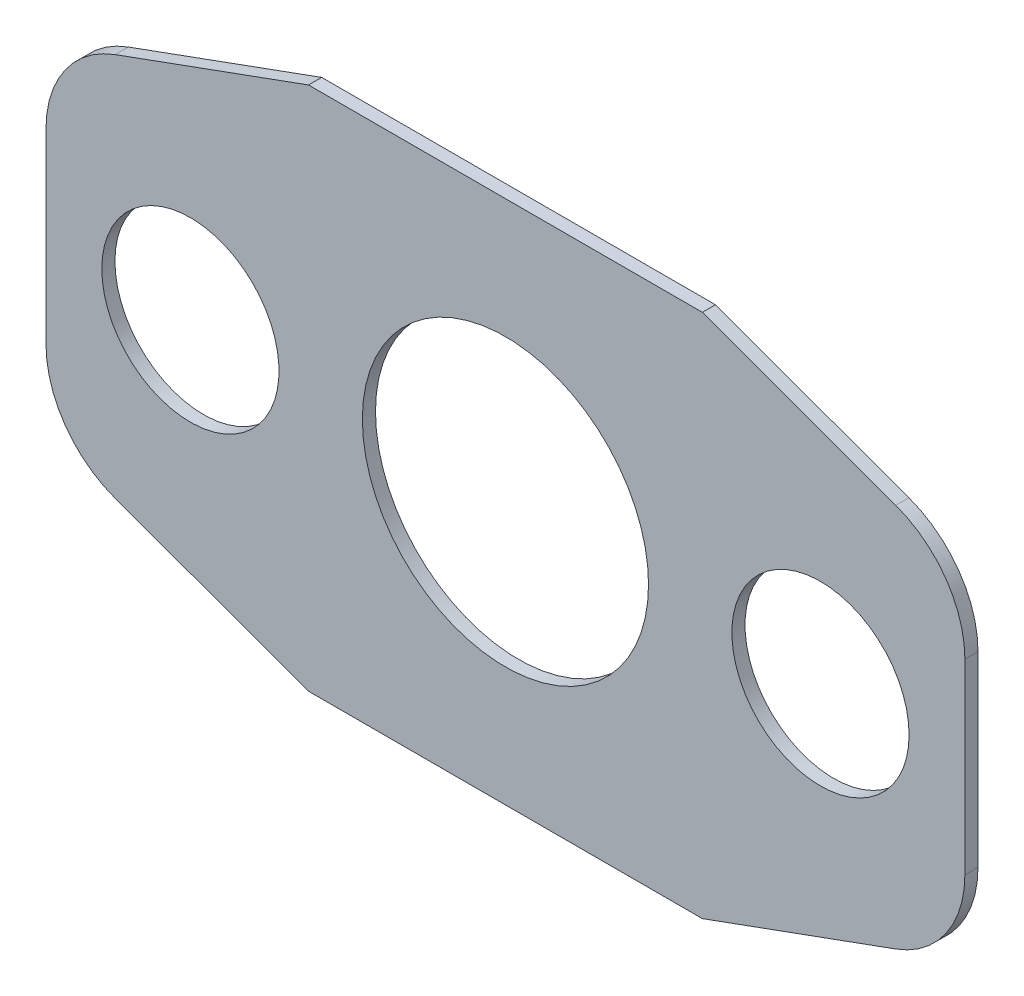
ISO-10303-21;
HEADER;
FILE_DESCRIPTION(('STEP AP214'),'2;1');
FILE_NAME('part.step','',(''),(''),'','','');
FILE_SCHEMA(('AUTOMOTIVE_DESIGN { 1 0 10303 214 1 1 1 1 }'));
ENDSEC;
DATA;
#1=APPLICATION_CONTEXT('core data for automotive mechanical design processes');
#2=APPLICATION_PROTOCOL_DEFINITION('international standard','automotive_design',2000,#1);
#3=PRODUCT_CONTEXT('',#1,'mechanical');
#4=PRODUCT('Part','Part','',(#3));
#5=PRODUCT_RELATED_PRODUCT_CATEGORY('part','',(#4));
#6=PRODUCT_DEFINITION_FORMATION('','',#4);
#7=PRODUCT_DEFINITION_CONTEXT('part definition',#1,'design');
#8=PRODUCT_DEFINITION('design','',#6,#7);
#9=PRODUCT_DEFINITION_SHAPE('','',#8);
#10=(LENGTH_UNIT() NAMED_UNIT(*) SI_UNIT(.MILLI.,.METRE.));
#11=(NAMED_UNIT(*) PLANE_ANGLE_UNIT() SI_UNIT($,.RADIAN.));
#12=(NAMED_UNIT(*) SI_UNIT($,.STERADIAN.) SOLID_ANGLE_UNIT());
#13=UNCERTAINTY_MEASURE_WITH_UNIT(LENGTH_MEASURE(1.E-05),#10,'distance_accuracy_value','');
#14=(GEOMETRIC_REPRESENTATION_CONTEXT(3) GLOBAL_UNCERTAINTY_ASSIGNED_CONTEXT((#13)) GLOBAL_UNIT_ASSIGNED_CONTEXT((#10,
#11,#12)) REPRESENTATION_CONTEXT('',''));
#15=CARTESIAN_POINT('',(0.,0.,0.));
#16=DIRECTION('',(0.,0.,1.));
#17=DIRECTION('',(1.,0.,0.));
#18=AXIS2_PLACEMENT_3D('',#15,#16,#17);
#19=CARTESIAN_POINT('',(27.,7.11893500899826,-1.));
#20=DIRECTION('',(0.,0.,1.));
#21=DIRECTION('',(1.,0.,0.));
#22=AXIS2_PLACEMENT_3D('',#19,#20,#21);
#23=CYLINDRICAL_SURFACE('',#22,8.);
#24=CARTESIAN_POINT('',(27.,7.11893500899826,0.));
#25=DIRECTION('',(0.,0.,1.));
#26=DIRECTION('',(-1.,0.,0.));
#27=AXIS2_PLACEMENT_3D('',#24,#25,#26);
#28=CIRCLE('',#27,8.);
#29=CARTESIAN_POINT('',(35.,7.11893500899827,0.));
#30=VERTEX_POINT('',#29);
#31=CARTESIAN_POINT('',(29.7361611466054,14.6364759752855,0.));
#32=VERTEX_POINT('',#31);
#33=EDGE_CURVE('E162',#30,#32,#28,.T.);
#34=ORIENTED_EDGE('',*,*,#33,.F.);
#35=DIRECTION('',(0.,0.,1.));
#36=VECTOR('',#35,1.);
#37=CARTESIAN_POINT('',(35.,7.11893500899827,-1.));
#38=LINE('',#37,#36);
#39=CARTESIAN_POINT('',(35.,7.11893500899827,-1.));
#40=VERTEX_POINT('',#39);
#41=EDGE_CURVE('E11',#40,#30,#38,.T.);
#42=ORIENTED_EDGE('',*,*,#41,.F.);
#43=CARTESIAN_POINT('',(27.,7.11893500899826,-1.));
#44=DIRECTION('',(0.,0.,1.));
#45=DIRECTION('',(-1.,0.,0.));
#46=AXIS2_PLACEMENT_3D('',#43,#44,#45);
#47=CIRCLE('',#46,8.);
#48=CARTESIAN_POINT('',(29.7361611466054,14.6364759752855,-1.));
#49=VERTEX_POINT('',#48);
#50=EDGE_CURVE('E195',#40,#49,#47,.T.);
#51=ORIENTED_EDGE('',*,*,#50,.T.);
#52=DIRECTION('',(0.,0.,1.));
#53=VECTOR('',#52,1.);
#54=CARTESIAN_POINT('',(29.7361611466054,14.6364759752855,-1.));
#55=LINE('',#54,#53);
#56=EDGE_CURVE('E44',#49,#32,#55,.T.);
#57=ORIENTED_EDGE('',*,*,#56,.T.);
#58=EDGE_LOOP('',(#34,#42,#51,#57));
#59=FACE_BOUND('',#58,.T.);
#60=ADVANCED_FACE('F41',(#59),#23,.T.);
#61=CARTESIAN_POINT('',(35.,7.11893500899827,-1.));
#62=DIRECTION('',(1.,0.,0.));
#63=DIRECTION('',(0.,0.,-1.));
#64=AXIS2_PLACEMENT_3D('',#61,#62,#63);
#65=PLANE('',#64);
#66=DIRECTION('',(0.,1.,0.));
#67=VECTOR('',#66,1.);
#68=CARTESIAN_POINT('',(35.,7.11893500899827,0.));
#69=LINE('',#68,#67);
#70=CARTESIAN_POINT('',(35.,-7.11893500899827,0.));
#71=VERTEX_POINT('',#70);
#72=EDGE_CURVE('E193',#71,#30,#69,.T.);
#73=ORIENTED_EDGE('',*,*,#72,.F.);
#74=DIRECTION('',(0.,0.,1.));
#75=VECTOR('',#74,1.);
#76=CARTESIAN_POINT('',(35.,-7.11893500899827,-1.));
#77=LINE('',#76,#75);
#78=CARTESIAN_POINT('',(35.,-7.11893500899827,-1.));
#79=VERTEX_POINT('',#78);
#80=EDGE_CURVE('E50',#79,#71,#77,.T.);
#81=ORIENTED_EDGE('',*,*,#80,.F.);
#82=DIRECTION('',(0.,1.,0.));
#83=VECTOR('',#82,1.);
#84=CARTESIAN_POINT('',(35.,7.11893500899827,-1.));
#85=LINE('',#84,#83);
#86=EDGE_CURVE('E152',#79,#40,#85,.T.);
#87=ORIENTED_EDGE('',*,*,#86,.T.);
#88=ORIENTED_EDGE('',*,*,#41,.T.);
#89=EDGE_LOOP('',(#73,#81,#87,#88));
#90=FACE_BOUND('',#89,.T.);
#91=ADVANCED_FACE('F215',(#90),#65,.T.);
#92=CARTESIAN_POINT('',(27.,-7.11893500899827,-1.));
#93=DIRECTION('',(0.,0.,1.));
#94=DIRECTION('',(1.,0.,0.));
#95=AXIS2_PLACEMENT_3D('',#92,#93,#94);
#96=CYLINDRICAL_SURFACE('',#95,8.);
#97=CARTESIAN_POINT('',(27.,-7.11893500899827,0.));
#98=DIRECTION('',(0.,0.,1.));
#99=DIRECTION('',(1.,0.,0.));
#100=AXIS2_PLACEMENT_3D('',#97,#98,#99);
#101=CIRCLE('',#100,8.);
#102=CARTESIAN_POINT('',(29.7361611466054,-14.6364759752855,0.));
#103=VERTEX_POINT('',#102);
#104=EDGE_CURVE('E139',#103,#71,#101,.T.);
#105=ORIENTED_EDGE('',*,*,#104,.F.);
#106=DIRECTION('',(0.,0.,1.));
#107=VECTOR('',#106,1.);
#108=CARTESIAN_POINT('',(29.7361611466054,-14.6364759752855,-1.));
#109=LINE('',#108,#107);
#110=CARTESIAN_POINT('',(29.7361611466054,-14.6364759752855,-1.));
#111=VERTEX_POINT('',#110);
#112=EDGE_CURVE('E134',#111,#103,#109,.T.);
#113=ORIENTED_EDGE('',*,*,#112,.F.);
#114=CARTESIAN_POINT('',(27.,-7.11893500899827,-1.));
#115=DIRECTION('',(0.,0.,1.));
#116=DIRECTION('',(1.,0.,0.));
#117=AXIS2_PLACEMENT_3D('',#114,#115,#116);
#118=CIRCLE('',#117,8.);
#119=EDGE_CURVE('E137',#111,#79,#118,.T.);
#120=ORIENTED_EDGE('',*,*,#119,.T.);
#121=ORIENTED_EDGE('',*,*,#80,.T.);
#122=EDGE_LOOP('',(#105,#113,#120,#121));
#123=FACE_BOUND('',#122,.T.);
#124=ADVANCED_FACE('F136',(#123),#96,.T.);
#125=CARTESIAN_POINT('',(15.,-20.,-1.));
#126=DIRECTION('',(0.34202014332567,-0.939692620785908,0.));
#127=DIRECTION('',(0.939692620785908,0.34202014332567,0.));
#128=AXIS2_PLACEMENT_3D('',#125,#126,#127);
#129=PLANE('',#128);
#130=DIRECTION('',(0.939692620785908,0.34202014332567,0.));
#131=VECTOR('',#130,1.);
#132=CARTESIAN_POINT('',(15.,-20.,0.));
#133=LINE('',#132,#131);
#134=CARTESIAN_POINT('',(15.,-20.,0.));
#135=VERTEX_POINT('',#134);
#136=EDGE_CURVE('E190',#135,#103,#133,.T.);
#137=ORIENTED_EDGE('',*,*,#136,.F.);
#138=DIRECTION('',(0.,0.,1.));
#139=VECTOR('',#138,1.);
#140=CARTESIAN_POINT('',(15.,-20.,-1.));
#141=LINE('',#140,#139);
#142=CARTESIAN_POINT('',(15.,-20.,-1.));
#143=VERTEX_POINT('',#142);
#144=EDGE_CURVE('E144',#143,#135,#141,.T.);
#145=ORIENTED_EDGE('',*,*,#144,.F.);
#146=DIRECTION('',(0.939692620785908,0.34202014332567,0.));
#147=VECTOR('',#146,1.);
#148=CARTESIAN_POINT('',(15.,-20.,-1.));
#149=LINE('',#148,#147);
#150=EDGE_CURVE('E150',#143,#111,#149,.T.);
#151=ORIENTED_EDGE('',*,*,#150,.T.);
#152=ORIENTED_EDGE('',*,*,#112,.T.);
#153=EDGE_LOOP('',(#137,#145,#151,#152));
#154=FACE_BOUND('',#153,.T.);
#155=ADVANCED_FACE('F154',(#154),#129,.T.);
#156=CARTESIAN_POINT('',(-15.,-20.,-1.));
#157=DIRECTION('',(0.,-1.,0.));
#158=DIRECTION('',(0.,0.,-1.));
#159=AXIS2_PLACEMENT_3D('',#156,#157,#158);
#160=PLANE('',#159);
#161=DIRECTION('',(1.,0.,0.));
#162=VECTOR('',#161,1.);
#163=CARTESIAN_POINT('',(-15.,-20.,0.));
#164=LINE('',#163,#162);
#165=CARTESIAN_POINT('',(-15.,-20.,0.));
#166=VERTEX_POINT('',#165);
#167=EDGE_CURVE('E187',#166,#135,#164,.T.);
#168=ORIENTED_EDGE('',*,*,#167,.F.);
#169=DIRECTION('',(0.,0.,1.));
#170=VECTOR('',#169,1.);
#171=CARTESIAN_POINT('',(-15.,-20.,-1.));
#172=LINE('',#171,#170);
#173=CARTESIAN_POINT('',(-15.,-20.,-1.));
#174=VERTEX_POINT('',#173);
#175=EDGE_CURVE('E199',#174,#166,#172,.T.);
#176=ORIENTED_EDGE('',*,*,#175,.F.);
#177=DIRECTION('',(1.,0.,0.));
#178=VECTOR('',#177,1.);
#179=CARTESIAN_POINT('',(-15.,-20.,-1.));
#180=LINE('',#179,#178);
#181=EDGE_CURVE('E155',#174,#143,#180,.T.);
#182=ORIENTED_EDGE('',*,*,#181,.T.);
#183=ORIENTED_EDGE('',*,*,#144,.T.);
#184=EDGE_LOOP('',(#168,#176,#182,#183));
#185=FACE_BOUND('',#184,.T.);
#186=ADVANCED_FACE('F228',(#185),#160,.T.);
#187=CARTESIAN_POINT('',(-15.,-20.,-1.));
#188=DIRECTION('',(-0.342020143325669,-0.939692620785908,0.));
#189=DIRECTION('',(0.939692620785908,-0.342020143325669,0.));
#190=AXIS2_PLACEMENT_3D('',#187,#188,#189);
#191=PLANE('',#190);
#192=DIRECTION('',(0.939692620785908,-0.342020143325669,0.));
#193=VECTOR('',#192,1.);
#194=CARTESIAN_POINT('',(-15.,-20.,0.));
#195=LINE('',#194,#193);
#196=CARTESIAN_POINT('',(-29.7361611466054,-14.6364759752855,0.));
#197=VERTEX_POINT('',#196);
#198=EDGE_CURVE('E184',#197,#166,#195,.T.);
#199=ORIENTED_EDGE('',*,*,#198,.F.);
#200=DIRECTION('',(0.,0.,1.));
#201=VECTOR('',#200,1.);
#202=CARTESIAN_POINT('',(-29.7361611466054,-14.6364759752855,-1.));
#203=LINE('',#202,#201);
#204=CARTESIAN_POINT('',(-29.7361611466054,-14.6364759752855,-1.));
#205=VERTEX_POINT('',#204);
#206=EDGE_CURVE('E201',#205,#197,#203,.T.);
#207=ORIENTED_EDGE('',*,*,#206,.F.);
#208=DIRECTION('',(0.939692620785908,-0.342020143325669,0.));
#209=VECTOR('',#208,1.);
#210=CARTESIAN_POINT('',(-15.,-20.,-1.));
#211=LINE('',#210,#209);
#212=EDGE_CURVE('E157',#205,#174,#211,.T.);
#213=ORIENTED_EDGE('',*,*,#212,.T.);
#214=ORIENTED_EDGE('',*,*,#175,.T.);
#215=EDGE_LOOP('',(#199,#207,#213,#214));
#216=FACE_BOUND('',#215,.T.);
#217=ADVANCED_FACE('F231',(#216),#191,.T.);
#218=CARTESIAN_POINT('',(-27.,-7.11893500899828,-1.));
#219=DIRECTION('',(0.,0.,1.));
#220=DIRECTION('',(1.,0.,0.));
#221=AXIS2_PLACEMENT_3D('',#218,#219,#220);
#222=CYLINDRICAL_SURFACE('',#221,8.);
#223=CARTESIAN_POINT('',(-27.,-7.11893500899828,0.));
#224=DIRECTION('',(0.,0.,1.));
#225=DIRECTION('',(-1.,0.,0.));
#226=AXIS2_PLACEMENT_3D('',#223,#224,#225);
#227=CIRCLE('',#226,8.);
#228=CARTESIAN_POINT('',(-35.,-7.11893500899828,0.));
#229=VERTEX_POINT('',#228);
#230=EDGE_CURVE('E181',#229,#197,#227,.T.);
#231=ORIENTED_EDGE('',*,*,#230,.F.);
#232=DIRECTION('',(0.,0.,1.));
#233=VECTOR('',#232,1.);
#234=CARTESIAN_POINT('',(-35.,-7.11893500899828,-1.));
#235=LINE('',#234,#233);
#236=CARTESIAN_POINT('',(-35.,-7.11893500899828,-1.));
#237=VERTEX_POINT('',#236);
#238=EDGE_CURVE('E203',#237,#229,#235,.T.);
#239=ORIENTED_EDGE('',*,*,#238,.F.);
#240=CARTESIAN_POINT('',(-27.,-7.11893500899828,-1.));
#241=DIRECTION('',(0.,0.,1.));
#242=DIRECTION('',(-1.,0.,0.));
#243=AXIS2_PLACEMENT_3D('',#240,#241,#242);
#244=CIRCLE('',#243,8.);
#245=EDGE_CURVE('E315',#237,#205,#244,.T.);
#246=ORIENTED_EDGE('',*,*,#245,.T.);
#247=ORIENTED_EDGE('',*,*,#206,.T.);
#248=EDGE_LOOP('',(#231,#239,#246,#247));
#249=FACE_BOUND('',#248,.T.);
#250=ADVANCED_FACE('F235',(#249),#222,.T.);
#251=CARTESIAN_POINT('',(-35.,7.11893500899827,-1.));
#252=DIRECTION('',(-1.,0.,0.));
#253=DIRECTION('',(0.,0.,1.));
#254=AXIS2_PLACEMENT_3D('',#251,#252,#253);
#255=PLANE('',#254);
#256=DIRECTION('',(0.,-1.,0.));
#257=VECTOR('',#256,1.);
#258=CARTESIAN_POINT('',(-35.,7.11893500899827,0.));
#259=LINE('',#258,#257);
#260=CARTESIAN_POINT('',(-35.,7.11893500899827,0.));
#261=VERTEX_POINT('',#260);
#262=EDGE_CURVE('E178',#261,#229,#259,.T.);
#263=ORIENTED_EDGE('',*,*,#262,.F.);
#264=DIRECTION('',(0.,0.,1.));
#265=VECTOR('',#264,1.);
#266=CARTESIAN_POINT('',(-35.,7.11893500899827,-1.));
#267=LINE('',#266,#265);
#268=CARTESIAN_POINT('',(-35.,7.11893500899827,-1.));
#269=VERTEX_POINT('',#268);
#270=EDGE_CURVE('E205',#269,#261,#267,.T.);
#271=ORIENTED_EDGE('',*,*,#270,.F.);
#272=DIRECTION('',(0.,-1.,0.));
#273=VECTOR('',#272,1.);
#274=CARTESIAN_POINT('',(-35.,7.11893500899827,-1.));
#275=LINE('',#274,#273);
#276=EDGE_CURVE('E312',#269,#237,#275,.T.);
#277=ORIENTED_EDGE('',*,*,#276,.T.);
#278=ORIENTED_EDGE('',*,*,#238,.T.);
#279=EDGE_LOOP('',(#263,#271,#277,#278));
#280=FACE_BOUND('',#279,.T.);
#281=ADVANCED_FACE('F239',(#280),#255,.T.);
#282=CARTESIAN_POINT('',(-27.,7.11893500899826,-1.));
#283=DIRECTION('',(0.,0.,1.));
#284=DIRECTION('',(1.,0.,0.));
#285=AXIS2_PLACEMENT_3D('',#282,#283,#284);
#286=CYLINDRICAL_SURFACE('',#285,8.);
#287=CARTESIAN_POINT('',(-27.,7.11893500899826,0.));
#288=DIRECTION('',(0.,0.,1.));
#289=DIRECTION('',(1.,0.,0.));
#290=AXIS2_PLACEMENT_3D('',#287,#288,#289);
#291=CIRCLE('',#290,8.);
#292=CARTESIAN_POINT('',(-29.7361611466054,14.6364759752855,0.));
#293=VERTEX_POINT('',#292);
#294=EDGE_CURVE('E175',#293,#261,#291,.T.);
#295=ORIENTED_EDGE('',*,*,#294,.F.);
#296=DIRECTION('',(0.,0.,1.));
#297=VECTOR('',#296,1.);
#298=CARTESIAN_POINT('',(-29.7361611466054,14.6364759752855,-1.));
#299=LINE('',#298,#297);
#300=CARTESIAN_POINT('',(-29.7361611466054,14.6364759752855,-1.));
#301=VERTEX_POINT('',#300);
#302=EDGE_CURVE('E207',#301,#293,#299,.T.);
#303=ORIENTED_EDGE('',*,*,#302,.F.);
#304=CARTESIAN_POINT('',(-27.,7.11893500899826,-1.));
#305=DIRECTION('',(0.,0.,1.));
#306=DIRECTION('',(1.,0.,0.));
#307=AXIS2_PLACEMENT_3D('',#304,#305,#306);
#308=CIRCLE('',#307,8.);
#309=EDGE_CURVE('E309',#301,#269,#308,.T.);
#310=ORIENTED_EDGE('',*,*,#309,.T.);
#311=ORIENTED_EDGE('',*,*,#270,.T.);
#312=EDGE_LOOP('',(#295,#303,#310,#311));
#313=FACE_BOUND('',#312,.T.);
#314=ADVANCED_FACE('F243',(#313),#286,.T.);
#315=CARTESIAN_POINT('',(-15.,20.,-1.));
#316=DIRECTION('',(-0.342020143325669,0.939692620785908,0.));
#317=DIRECTION('',(-0.939692620785908,-0.342020143325669,0.));
#318=AXIS2_PLACEMENT_3D('',#315,#316,#317);
#319=PLANE('',#318);
#320=DIRECTION('',(-0.939692620785908,-0.342020143325669,0.));
#321=VECTOR('',#320,1.);
#322=CARTESIAN_POINT('',(-15.,20.,0.));
#323=LINE('',#322,#321);
#324=CARTESIAN_POINT('',(-15.,20.,0.));
#325=VERTEX_POINT('',#324);
#326=EDGE_CURVE('E172',#325,#293,#323,.T.);
#327=ORIENTED_EDGE('',*,*,#326,.F.);
#328=DIRECTION('',(0.,0.,1.));
#329=VECTOR('',#328,1.);
#330=CARTESIAN_POINT('',(-15.,20.,-1.));
#331=LINE('',#330,#329);
#332=CARTESIAN_POINT('',(-15.,20.,-1.));
#333=VERTEX_POINT('',#332);
#334=EDGE_CURVE('E209',#333,#325,#331,.T.);
#335=ORIENTED_EDGE('',*,*,#334,.F.);
#336=DIRECTION('',(-0.939692620785908,-0.342020143325669,0.));
#337=VECTOR('',#336,1.);
#338=CARTESIAN_POINT('',(-15.,20.,-1.));
#339=LINE('',#338,#337);
#340=EDGE_CURVE('E306',#333,#301,#339,.T.);
#341=ORIENTED_EDGE('',*,*,#340,.T.);
#342=ORIENTED_EDGE('',*,*,#302,.T.);
#343=EDGE_LOOP('',(#327,#335,#341,#342));
#344=FACE_BOUND('',#343,.T.);
#345=ADVANCED_FACE('F247',(#344),#319,.T.);
#346=CARTESIAN_POINT('',(-15.,20.,-1.));
#347=DIRECTION('',(0.,1.,0.));
#348=DIRECTION('',(-1.,0.,0.));
#349=AXIS2_PLACEMENT_3D('',#346,#347,#348);
#350=PLANE('',#349);
#351=DIRECTION('',(-1.,0.,0.));
#352=VECTOR('',#351,1.);
#353=CARTESIAN_POINT('',(-15.,20.,0.));
#354=LINE('',#353,#352);
#355=CARTESIAN_POINT('',(15.,20.,0.));
#356=VERTEX_POINT('',#355);
#357=EDGE_CURVE('E169',#356,#325,#354,.T.);
#358=ORIENTED_EDGE('',*,*,#357,.F.);
#359=DIRECTION('',(0.,0.,1.));
#360=VECTOR('',#359,1.);
#361=CARTESIAN_POINT('',(15.,20.,-1.));
#362=LINE('',#361,#360);
#363=CARTESIAN_POINT('',(15.,20.,-1.));
#364=VERTEX_POINT('',#363);
#365=EDGE_CURVE('E210',#364,#356,#362,.T.);
#366=ORIENTED_EDGE('',*,*,#365,.F.);
#367=DIRECTION('',(-1.,0.,0.));
#368=VECTOR('',#367,1.);
#369=CARTESIAN_POINT('',(-15.,20.,-1.));
#370=LINE('',#369,#368);
#371=EDGE_CURVE('E303',#364,#333,#370,.T.);
#372=ORIENTED_EDGE('',*,*,#371,.T.);
#373=ORIENTED_EDGE('',*,*,#334,.T.);
#374=EDGE_LOOP('',(#358,#366,#372,#373));
#375=FACE_BOUND('',#374,.T.);
#376=ADVANCED_FACE('F251',(#375),#350,.T.);
#377=CARTESIAN_POINT('',(15.,20.,-1.));
#378=DIRECTION('',(0.34202014332567,0.939692620785908,0.));
#379=DIRECTION('',(-0.939692620785908,0.34202014332567,0.));
#380=AXIS2_PLACEMENT_3D('',#377,#378,#379);
#381=PLANE('',#380);
#382=DIRECTION('',(-0.939692620785908,0.342020143325669,0.));
#383=VECTOR('',#382,1.);
#384=CARTESIAN_POINT('',(15.,20.,0.));
#385=LINE('',#384,#383);
#386=EDGE_CURVE('E165',#32,#356,#385,.T.);
#387=ORIENTED_EDGE('',*,*,#386,.F.);
#388=ORIENTED_EDGE('',*,*,#56,.F.);
#389=DIRECTION('',(-0.939692620785908,0.342020143325669,0.));
#390=VECTOR('',#389,1.);
#391=CARTESIAN_POINT('',(15.,20.,-1.));
#392=LINE('',#391,#390);
#393=EDGE_CURVE('E301',#49,#364,#392,.T.);
#394=ORIENTED_EDGE('',*,*,#393,.T.);
#395=ORIENTED_EDGE('',*,*,#365,.T.);
#396=EDGE_LOOP('',(#387,#388,#394,#395));
#397=FACE_BOUND('',#396,.T.);
#398=ADVANCED_FACE('F212',(#397),#381,.T.);
#399=CARTESIAN_POINT('',(27.,7.11893500899826,-1.));
#400=DIRECTION('',(0.,0.,-1.));
#401=DIRECTION('',(-1.,0.,0.));
#402=AXIS2_PLACEMENT_3D('',#399,#400,#401);
#403=PLANE('',#402);
#404=CARTESIAN_POINT('',(-24.,0.,-1.));
#405=DIRECTION('',(0.,0.,1.));
#406=DIRECTION('',(-1.,0.,0.));
#407=AXIS2_PLACEMENT_3D('',#404,#405,#406);
#408=CIRCLE('',#407,6.75);
#409=CARTESIAN_POINT('',(-30.75,0.,-1.));
#410=VERTEX_POINT('',#409);
#411=EDGE_CURVE('E282',#410,#410,#408,.T.);
#412=ORIENTED_EDGE('',*,*,#411,.T.);
#413=EDGE_LOOP('',(#412));
#414=FACE_BOUND('',#413,.T.);
#415=CARTESIAN_POINT('',(24.,0.,-1.));
#416=DIRECTION('',(0.,0.,1.));
#417=DIRECTION('',(1.,0.,0.));
#418=AXIS2_PLACEMENT_3D('',#415,#416,#417);
#419=CIRCLE('',#418,6.75);
#420=CARTESIAN_POINT('',(30.75,0.,-1.));
#421=VERTEX_POINT('',#420);
#422=EDGE_CURVE('E290',#421,#421,#419,.T.);
#423=ORIENTED_EDGE('',*,*,#422,.T.);
#424=EDGE_LOOP('',(#423));
#425=FACE_BOUND('',#424,.T.);
#426=CARTESIAN_POINT('',(0.,0.,-1.));
#427=DIRECTION('',(0.,0.,1.));
#428=DIRECTION('',(1.,0.,0.));
#429=AXIS2_PLACEMENT_3D('',#426,#427,#428);
#430=CIRCLE('',#429,10.9);
#431=CARTESIAN_POINT('',(10.9,0.,-1.));
#432=VERTEX_POINT('',#431);
#433=EDGE_CURVE('E166',#432,#432,#430,.T.);
#434=ORIENTED_EDGE('',*,*,#433,.T.);
#435=EDGE_LOOP('',(#434));
#436=FACE_BOUND('',#435,.T.);
#437=ORIENTED_EDGE('',*,*,#50,.F.);
#438=ORIENTED_EDGE('',*,*,#86,.F.);
#439=ORIENTED_EDGE('',*,*,#119,.F.);
#440=ORIENTED_EDGE('',*,*,#150,.F.);
#441=ORIENTED_EDGE('',*,*,#181,.F.);
#442=ORIENTED_EDGE('',*,*,#212,.F.);
#443=ORIENTED_EDGE('',*,*,#245,.F.);
#444=ORIENTED_EDGE('',*,*,#276,.F.);
#445=ORIENTED_EDGE('',*,*,#309,.F.);
#446=ORIENTED_EDGE('',*,*,#340,.F.);
#447=ORIENTED_EDGE('',*,*,#371,.F.);
#448=ORIENTED_EDGE('',*,*,#393,.F.);
#449=EDGE_LOOP('',(#437,#438,#439,#440,#441,#442,#443,#444,#445,#446,#447,#448));
#450=FACE_BOUND('',#449,.T.);
#451=ADVANCED_FACE('F148',(#414,#425,#436,#450),#403,.T.);
#452=CARTESIAN_POINT('',(27.,7.11893500899826,0.));
#453=DIRECTION('',(0.,0.,-1.));
#454=DIRECTION('',(-1.,0.,0.));
#455=AXIS2_PLACEMENT_3D('',#452,#453,#454);
#456=PLANE('',#455);
#457=CARTESIAN_POINT('',(-24.,0.,0.));
#458=DIRECTION('',(0.,0.,1.));
#459=DIRECTION('',(-1.,0.,0.));
#460=AXIS2_PLACEMENT_3D('',#457,#458,#459);
#461=CIRCLE('',#460,6.75);
#462=CARTESIAN_POINT('',(-30.75,0.,0.));
#463=VERTEX_POINT('',#462);
#464=EDGE_CURVE('E285',#463,#463,#461,.T.);
#465=ORIENTED_EDGE('',*,*,#464,.F.);
#466=EDGE_LOOP('',(#465));
#467=FACE_BOUND('',#466,.T.);
#468=CARTESIAN_POINT('',(24.,0.,0.));
#469=DIRECTION('',(0.,0.,1.));
#470=DIRECTION('',(1.,0.,0.));
#471=AXIS2_PLACEMENT_3D('',#468,#469,#470);
#472=CIRCLE('',#471,6.75);
#473=CARTESIAN_POINT('',(30.75,0.,0.));
#474=VERTEX_POINT('',#473);
#475=EDGE_CURVE('E287',#474,#474,#472,.T.);
#476=ORIENTED_EDGE('',*,*,#475,.F.);
#477=EDGE_LOOP('',(#476));
#478=FACE_BOUND('',#477,.T.);
#479=CARTESIAN_POINT('',(0.,0.,0.));
#480=DIRECTION('',(0.,0.,1.));
#481=DIRECTION('',(1.,0.,0.));
#482=AXIS2_PLACEMENT_3D('',#479,#480,#481);
#483=CIRCLE('',#482,10.9);
#484=CARTESIAN_POINT('',(10.9,0.,0.));
#485=VERTEX_POINT('',#484);
#486=EDGE_CURVE('E293',#485,#485,#483,.T.);
#487=ORIENTED_EDGE('',*,*,#486,.F.);
#488=EDGE_LOOP('',(#487));
#489=FACE_BOUND('',#488,.T.);
#490=ORIENTED_EDGE('',*,*,#33,.T.);
#491=ORIENTED_EDGE('',*,*,#386,.T.);
#492=ORIENTED_EDGE('',*,*,#357,.T.);
#493=ORIENTED_EDGE('',*,*,#326,.T.);
#494=ORIENTED_EDGE('',*,*,#294,.T.);
#495=ORIENTED_EDGE('',*,*,#262,.T.);
#496=ORIENTED_EDGE('',*,*,#230,.T.);
#497=ORIENTED_EDGE('',*,*,#198,.T.);
#498=ORIENTED_EDGE('',*,*,#167,.T.);
#499=ORIENTED_EDGE('',*,*,#136,.T.);
#500=ORIENTED_EDGE('',*,*,#104,.T.);
#501=ORIENTED_EDGE('',*,*,#72,.T.);
#502=EDGE_LOOP('',(#490,#491,#492,#493,#494,#495,#496,#497,#498,#499,#500,#501));
#503=FACE_BOUND('',#502,.T.);
#504=ADVANCED_FACE('F214',(#467,#478,#489,#503),#456,.F.);
#505=CARTESIAN_POINT('',(0.,0.,-1.));
#506=DIRECTION('',(0.,0.,1.));
#507=DIRECTION('',(1.,0.,0.));
#508=AXIS2_PLACEMENT_3D('',#505,#506,#507);
#509=CYLINDRICAL_SURFACE('',#508,10.9);
#510=ORIENTED_EDGE('',*,*,#433,.F.);
#511=EDGE_LOOP('',(#510));
#512=FACE_BOUND('',#511,.T.);
#513=ORIENTED_EDGE('',*,*,#486,.T.);
#514=EDGE_LOOP('',(#513));
#515=FACE_BOUND('',#514,.T.);
#516=ADVANCED_FACE('F263',(#512,#515),#509,.F.);
#517=CARTESIAN_POINT('',(24.,0.,-1.));
#518=DIRECTION('',(0.,0.,1.));
#519=DIRECTION('',(1.,0.,0.));
#520=AXIS2_PLACEMENT_3D('',#517,#518,#519);
#521=CYLINDRICAL_SURFACE('',#520,6.75);
#522=ORIENTED_EDGE('',*,*,#422,.F.);
#523=EDGE_LOOP('',(#522));
#524=FACE_BOUND('',#523,.T.);
#525=ORIENTED_EDGE('',*,*,#475,.T.);
#526=EDGE_LOOP('',(#525));
#527=FACE_BOUND('',#526,.T.);
#528=ADVANCED_FACE('F270',(#524,#527),#521,.F.);
#529=CARTESIAN_POINT('',(-24.,0.,-1.));
#530=DIRECTION('',(0.,0.,1.));
#531=DIRECTION('',(1.,0.,0.));
#532=AXIS2_PLACEMENT_3D('',#529,#530,#531);
#533=CYLINDRICAL_SURFACE('',#532,6.75);
#534=ORIENTED_EDGE('',*,*,#411,.F.);
#535=EDGE_LOOP('',(#534));
#536=FACE_BOUND('',#535,.T.);
#537=ORIENTED_EDGE('',*,*,#464,.T.);
#538=EDGE_LOOP('',(#537));
#539=FACE_BOUND('',#538,.T.);
#540=ADVANCED_FACE('F274',(#536,#539),#533,.F.);
#541=CLOSED_SHELL('',(#60,#91,#124,#155,#186,#217,#250,#281,#314,#345,#376,#398,#451,#504,#516,
#528,#540));
#542=MANIFOLD_SOLID_BREP('B2',#541);
#543=ADVANCED_BREP_SHAPE_REPRESENTATION('',(#18,#542),#14);
#544=SHAPE_DEFINITION_REPRESENTATION(#9,#543);
ENDSEC;
END-ISO-10303-21;
